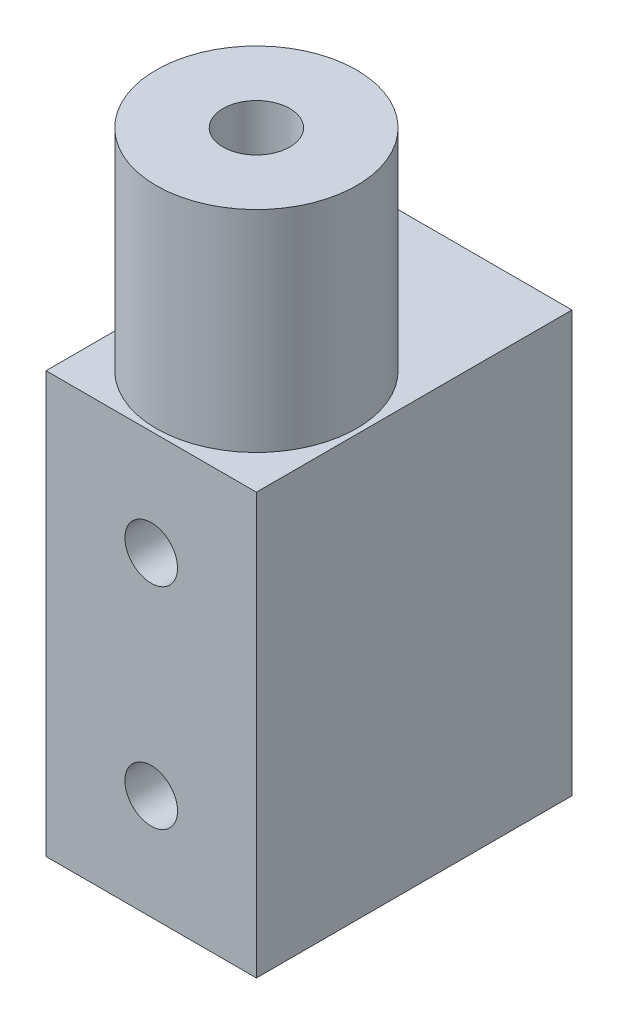
ISO-10303-21;
HEADER;
FILE_DESCRIPTION(('STEP AP214'),'2;1');
FILE_NAME('part.step','',(''),(''),'','','');
FILE_SCHEMA(('AUTOMOTIVE_DESIGN { 1 0 10303 214 1 1 1 1 }'));
ENDSEC;
DATA;
#1=APPLICATION_CONTEXT('core data for automotive mechanical design processes');
#2=APPLICATION_PROTOCOL_DEFINITION('international standard','automotive_design',2000,#1);
#3=PRODUCT_CONTEXT('',#1,'mechanical');
#4=PRODUCT('Part','Part','',(#3));
#5=PRODUCT_RELATED_PRODUCT_CATEGORY('part','',(#4));
#6=PRODUCT_DEFINITION_FORMATION('','',#4);
#7=PRODUCT_DEFINITION_CONTEXT('part definition',#1,'design');
#8=PRODUCT_DEFINITION('design','',#6,#7);
#9=PRODUCT_DEFINITION_SHAPE('','',#8);
#10=(LENGTH_UNIT() NAMED_UNIT(*) SI_UNIT(.MILLI.,.METRE.));
#11=(NAMED_UNIT(*) PLANE_ANGLE_UNIT() SI_UNIT($,.RADIAN.));
#12=(NAMED_UNIT(*) SI_UNIT($,.STERADIAN.) SOLID_ANGLE_UNIT());
#13=UNCERTAINTY_MEASURE_WITH_UNIT(LENGTH_MEASURE(1.E-05),#10,'distance_accuracy_value','');
#14=(GEOMETRIC_REPRESENTATION_CONTEXT(3) GLOBAL_UNCERTAINTY_ASSIGNED_CONTEXT((#13)) GLOBAL_UNIT_ASSIGNED_CONTEXT((#10,
#11,#12)) REPRESENTATION_CONTEXT('',''));
#15=CARTESIAN_POINT('',(0.,0.,0.));
#16=DIRECTION('',(0.,0.,1.));
#17=DIRECTION('',(1.,0.,0.));
#18=AXIS2_PLACEMENT_3D('',#15,#16,#17);
#19=CARTESIAN_POINT('',(0.,0.,-30.));
#20=DIRECTION('',(-1.,0.,0.));
#21=DIRECTION('',(0.,0.,1.));
#22=AXIS2_PLACEMENT_3D('',#19,#20,#21);
#23=PLANE('',#22);
#24=DIRECTION('',(0.,-1.,0.));
#25=VECTOR('',#24,1.);
#26=CARTESIAN_POINT('',(0.,0.,0.));
#27=LINE('',#26,#25);
#28=CARTESIAN_POINT('',(0.,40.,0.));
#29=VERTEX_POINT('',#28);
#30=CARTESIAN_POINT('',(0.,0.,0.));
#31=VERTEX_POINT('',#30);
#32=EDGE_CURVE('E99',#29,#31,#27,.T.);
#33=ORIENTED_EDGE('',*,*,#32,.F.);
#34=DIRECTION('',(0.,0.,1.));
#35=VECTOR('',#34,1.);
#36=CARTESIAN_POINT('',(0.,40.,-30.));
#37=LINE('',#36,#35);
#38=CARTESIAN_POINT('',(0.,40.,-30.));
#39=VERTEX_POINT('',#38);
#40=EDGE_CURVE('E41',#39,#29,#37,.T.);
#41=ORIENTED_EDGE('',*,*,#40,.F.);
#42=DIRECTION('',(0.,-1.,0.));
#43=VECTOR('',#42,1.);
#44=CARTESIAN_POINT('',(0.,0.,-30.));
#45=LINE('',#44,#43);
#46=CARTESIAN_POINT('',(0.,0.,-30.));
#47=VERTEX_POINT('',#46);
#48=EDGE_CURVE('E92',#39,#47,#45,.T.);
#49=ORIENTED_EDGE('',*,*,#48,.T.);
#50=DIRECTION('',(0.,0.,1.));
#51=VECTOR('',#50,1.);
#52=CARTESIAN_POINT('',(0.,0.,-30.));
#53=LINE('',#52,#51);
#54=EDGE_CURVE('E35',#47,#31,#53,.T.);
#55=ORIENTED_EDGE('',*,*,#54,.T.);
#56=EDGE_LOOP('',(#33,#41,#49,#55));
#57=FACE_BOUND('',#56,.T.);
#58=ADVANCED_FACE('F32',(#57),#23,.T.);
#59=CARTESIAN_POINT('',(0.,40.,-30.));
#60=DIRECTION('',(0.,1.,0.));
#61=DIRECTION('',(0.,0.,1.));
#62=AXIS2_PLACEMENT_3D('',#59,#60,#61);
#63=PLANE('',#62);
#64=CARTESIAN_POINT('',(10.,40.,-10.));
#65=DIRECTION('',(0.,1.,0.));
#66=DIRECTION('',(0.,0.,1.));
#67=AXIS2_PLACEMENT_3D('',#64,#65,#66);
#68=CIRCLE('',#67,9.52500000000001);
#69=CARTESIAN_POINT('',(10.,40.,-0.474999999999993));
#70=VERTEX_POINT('',#69);
#71=EDGE_CURVE('E11',#70,#70,#68,.T.);
#72=ORIENTED_EDGE('',*,*,#71,.F.);
#73=EDGE_LOOP('',(#72));
#74=FACE_BOUND('',#73,.T.);
#75=DIRECTION('',(-1.,0.,0.));
#76=VECTOR('',#75,1.);
#77=CARTESIAN_POINT('',(0.,40.,0.));
#78=LINE('',#77,#76);
#79=CARTESIAN_POINT('',(20.,40.,0.));
#80=VERTEX_POINT('',#79);
#81=EDGE_CURVE('E94',#80,#29,#78,.T.);
#82=ORIENTED_EDGE('',*,*,#81,.F.);
#83=DIRECTION('',(0.,0.,1.));
#84=VECTOR('',#83,1.);
#85=CARTESIAN_POINT('',(20.,40.,-30.));
#86=LINE('',#85,#84);
#87=CARTESIAN_POINT('',(20.,40.,-30.));
#88=VERTEX_POINT('',#87);
#89=EDGE_CURVE('E66',#88,#80,#86,.T.);
#90=ORIENTED_EDGE('',*,*,#89,.F.);
#91=DIRECTION('',(-1.,0.,0.));
#92=VECTOR('',#91,1.);
#93=CARTESIAN_POINT('',(0.,40.,-30.));
#94=LINE('',#93,#92);
#95=EDGE_CURVE('E89',#88,#39,#94,.T.);
#96=ORIENTED_EDGE('',*,*,#95,.T.);
#97=ORIENTED_EDGE('',*,*,#40,.T.);
#98=EDGE_LOOP('',(#82,#90,#96,#97));
#99=FACE_BOUND('',#98,.T.);
#100=ADVANCED_FACE('F111',(#74,#99),#63,.T.);
#101=CARTESIAN_POINT('',(20.,0.,-30.));
#102=DIRECTION('',(1.,0.,0.));
#103=DIRECTION('',(0.,1.,0.));
#104=AXIS2_PLACEMENT_3D('',#101,#102,#103);
#105=PLANE('',#104);
#106=DIRECTION('',(0.,1.,0.));
#107=VECTOR('',#106,1.);
#108=CARTESIAN_POINT('',(20.,0.,0.));
#109=LINE('',#108,#107);
#110=CARTESIAN_POINT('',(20.,0.,0.));
#111=VERTEX_POINT('',#110);
#112=EDGE_CURVE('E84',#111,#80,#109,.T.);
#113=ORIENTED_EDGE('',*,*,#112,.F.);
#114=DIRECTION('',(0.,0.,1.));
#115=VECTOR('',#114,1.);
#116=CARTESIAN_POINT('',(20.,0.,-30.));
#117=LINE('',#116,#115);
#118=CARTESIAN_POINT('',(20.,0.,-30.));
#119=VERTEX_POINT('',#118);
#120=EDGE_CURVE('E79',#119,#111,#117,.T.);
#121=ORIENTED_EDGE('',*,*,#120,.F.);
#122=DIRECTION('',(0.,1.,0.));
#123=VECTOR('',#122,1.);
#124=CARTESIAN_POINT('',(20.,0.,-30.));
#125=LINE('',#124,#123);
#126=EDGE_CURVE('E82',#119,#88,#125,.T.);
#127=ORIENTED_EDGE('',*,*,#126,.T.);
#128=ORIENTED_EDGE('',*,*,#89,.T.);
#129=EDGE_LOOP('',(#113,#121,#127,#128));
#130=FACE_BOUND('',#129,.T.);
#131=ADVANCED_FACE('F81',(#130),#105,.T.);
#132=CARTESIAN_POINT('',(0.,0.,-30.));
#133=DIRECTION('',(0.,-1.,0.));
#134=DIRECTION('',(1.,0.,0.));
#135=AXIS2_PLACEMENT_3D('',#132,#133,#134);
#136=PLANE('',#135);
#137=DIRECTION('',(1.,0.,0.));
#138=VECTOR('',#137,1.);
#139=CARTESIAN_POINT('',(0.,0.,0.));
#140=LINE('',#139,#138);
#141=EDGE_CURVE('E102',#31,#111,#140,.T.);
#142=ORIENTED_EDGE('',*,*,#141,.F.);
#143=ORIENTED_EDGE('',*,*,#54,.F.);
#144=DIRECTION('',(1.,0.,0.));
#145=VECTOR('',#144,1.);
#146=CARTESIAN_POINT('',(0.,0.,-30.));
#147=LINE('',#146,#145);
#148=EDGE_CURVE('E88',#47,#119,#147,.T.);
#149=ORIENTED_EDGE('',*,*,#148,.T.);
#150=ORIENTED_EDGE('',*,*,#120,.T.);
#151=EDGE_LOOP('',(#142,#143,#149,#150));
#152=FACE_BOUND('',#151,.T.);
#153=ADVANCED_FACE('F91',(#152),#136,.T.);
#154=CARTESIAN_POINT('',(0.,0.,-30.));
#155=DIRECTION('',(0.,0.,-1.));
#156=DIRECTION('',(-1.,0.,0.));
#157=AXIS2_PLACEMENT_3D('',#154,#155,#156);
#158=PLANE('',#157);
#159=CARTESIAN_POINT('',(10.,10.,-30.));
#160=DIRECTION('',(0.,0.,1.));
#161=DIRECTION('',(1.,0.,0.));
#162=AXIS2_PLACEMENT_3D('',#159,#160,#161);
#163=CIRCLE('',#162,2.5);
#164=CARTESIAN_POINT('',(12.5,10.,-30.));
#165=VERTEX_POINT('',#164);
#166=EDGE_CURVE('E172',#165,#165,#163,.T.);
#167=ORIENTED_EDGE('',*,*,#166,.T.);
#168=EDGE_LOOP('',(#167));
#169=FACE_BOUND('',#168,.T.);
#170=CARTESIAN_POINT('',(10.,30.,-30.));
#171=DIRECTION('',(0.,0.,1.));
#172=DIRECTION('',(1.,0.,0.));
#173=AXIS2_PLACEMENT_3D('',#170,#171,#172);
#174=CIRCLE('',#173,2.49999999999999);
#175=CARTESIAN_POINT('',(12.5,30.,-30.));
#176=VERTEX_POINT('',#175);
#177=EDGE_CURVE('E103',#176,#176,#174,.T.);
#178=ORIENTED_EDGE('',*,*,#177,.T.);
#179=EDGE_LOOP('',(#178));
#180=FACE_BOUND('',#179,.T.);
#181=ORIENTED_EDGE('',*,*,#48,.F.);
#182=ORIENTED_EDGE('',*,*,#95,.F.);
#183=ORIENTED_EDGE('',*,*,#126,.F.);
#184=ORIENTED_EDGE('',*,*,#148,.F.);
#185=EDGE_LOOP('',(#181,#182,#183,#184));
#186=FACE_BOUND('',#185,.T.);
#187=ADVANCED_FACE('F87',(#169,#180,#186),#158,.T.);
#188=CARTESIAN_POINT('',(0.,0.,0.));
#189=DIRECTION('',(0.,0.,-1.));
#190=DIRECTION('',(-1.,0.,0.));
#191=AXIS2_PLACEMENT_3D('',#188,#189,#190);
#192=PLANE('',#191);
#193=CARTESIAN_POINT('',(10.,10.,0.));
#194=DIRECTION('',(0.,0.,1.));
#195=DIRECTION('',(1.,0.,0.));
#196=AXIS2_PLACEMENT_3D('',#193,#194,#195);
#197=CIRCLE('',#196,2.5);
#198=CARTESIAN_POINT('',(12.5,10.,0.));
#199=VERTEX_POINT('',#198);
#200=EDGE_CURVE('E167',#199,#199,#197,.T.);
#201=ORIENTED_EDGE('',*,*,#200,.F.);
#202=EDGE_LOOP('',(#201));
#203=FACE_BOUND('',#202,.T.);
#204=CARTESIAN_POINT('',(10.,30.,0.));
#205=DIRECTION('',(0.,0.,1.));
#206=DIRECTION('',(1.,0.,0.));
#207=AXIS2_PLACEMENT_3D('',#204,#205,#206);
#208=CIRCLE('',#207,2.49999999999999);
#209=CARTESIAN_POINT('',(12.5,30.,0.));
#210=VERTEX_POINT('',#209);
#211=EDGE_CURVE('E174',#210,#210,#208,.T.);
#212=ORIENTED_EDGE('',*,*,#211,.F.);
#213=EDGE_LOOP('',(#212));
#214=FACE_BOUND('',#213,.T.);
#215=ORIENTED_EDGE('',*,*,#32,.T.);
#216=ORIENTED_EDGE('',*,*,#141,.T.);
#217=ORIENTED_EDGE('',*,*,#112,.T.);
#218=ORIENTED_EDGE('',*,*,#81,.T.);
#219=EDGE_LOOP('',(#215,#216,#217,#218));
#220=FACE_BOUND('',#219,.T.);
#221=ADVANCED_FACE('F110',(#203,#214,#220),#192,.F.);
#222=CARTESIAN_POINT('',(10.,30.,-30.));
#223=DIRECTION('',(0.,0.,1.));
#224=DIRECTION('',(1.,0.,0.));
#225=AXIS2_PLACEMENT_3D('',#222,#223,#224);
#226=CYLINDRICAL_SURFACE('',#225,2.49999999999999);
#227=ORIENTED_EDGE('',*,*,#177,.F.);
#228=EDGE_LOOP('',(#227));
#229=FACE_BOUND('',#228,.T.);
#230=ORIENTED_EDGE('',*,*,#211,.T.);
#231=EDGE_LOOP('',(#230));
#232=FACE_BOUND('',#231,.T.);
#233=ADVANCED_FACE('F131',(#229,#232),#226,.F.);
#234=CARTESIAN_POINT('',(10.,10.,-30.));
#235=DIRECTION('',(0.,0.,1.));
#236=DIRECTION('',(1.,0.,0.));
#237=AXIS2_PLACEMENT_3D('',#234,#235,#236);
#238=CYLINDRICAL_SURFACE('',#237,2.5);
#239=ORIENTED_EDGE('',*,*,#166,.F.);
#240=EDGE_LOOP('',(#239));
#241=FACE_BOUND('',#240,.T.);
#242=ORIENTED_EDGE('',*,*,#200,.T.);
#243=EDGE_LOOP('',(#242));
#244=FACE_BOUND('',#243,.T.);
#245=ADVANCED_FACE('F138',(#241,#244),#238,.F.);
#246=CARTESIAN_POINT('',(10.,60.,-10.));
#247=DIRECTION('',(0.,-1.,0.));
#248=DIRECTION('',(0.,0.,-1.));
#249=AXIS2_PLACEMENT_3D('',#246,#247,#248);
#250=CYLINDRICAL_SURFACE('',#249,9.52500000000001);
#251=CARTESIAN_POINT('',(10.,60.,-10.));
#252=DIRECTION('',(0.,1.,0.));
#253=DIRECTION('',(0.,0.,1.));
#254=AXIS2_PLACEMENT_3D('',#251,#252,#253);
#255=CIRCLE('',#254,9.52500000000001);
#256=CARTESIAN_POINT('',(10.,60.,-0.474999999999993));
#257=VERTEX_POINT('',#256);
#258=EDGE_CURVE('E163',#257,#257,#255,.T.);
#259=ORIENTED_EDGE('',*,*,#258,.F.);
#260=EDGE_LOOP('',(#259));
#261=FACE_BOUND('',#260,.T.);
#262=ORIENTED_EDGE('',*,*,#71,.T.);
#263=EDGE_LOOP('',(#262));
#264=FACE_BOUND('',#263,.T.);
#265=ADVANCED_FACE('F142',(#261,#264),#250,.T.);
#266=CARTESIAN_POINT('',(10.,60.,-10.));
#267=DIRECTION('',(0.,1.,0.));
#268=DIRECTION('',(0.,0.,1.));
#269=AXIS2_PLACEMENT_3D('',#266,#267,#268);
#270=PLANE('',#269);
#271=CARTESIAN_POINT('',(10.,60.,-10.));
#272=DIRECTION('',(0.,1.,0.));
#273=DIRECTION('',(0.,0.,1.));
#274=AXIS2_PLACEMENT_3D('',#271,#272,#273);
#275=CIRCLE('',#274,3.175);
#276=CARTESIAN_POINT('',(10.,60.,-6.825));
#277=VERTEX_POINT('',#276);
#278=EDGE_CURVE('E164',#277,#277,#275,.T.);
#279=ORIENTED_EDGE('',*,*,#278,.F.);
#280=EDGE_LOOP('',(#279));
#281=FACE_BOUND('',#280,.T.);
#282=ORIENTED_EDGE('',*,*,#258,.T.);
#283=EDGE_LOOP('',(#282));
#284=FACE_BOUND('',#283,.T.);
#285=ADVANCED_FACE('F146',(#281,#284),#270,.T.);
#286=CARTESIAN_POINT('',(10.,31.0197438789308,-10.));
#287=DIRECTION('',(0.,1.,0.));
#288=DIRECTION('',(0.,0.,1.));
#289=AXIS2_PLACEMENT_3D('',#286,#287,#288);
#290=CYLINDRICAL_SURFACE('',#289,3.175);
#291=CARTESIAN_POINT('',(10.,40.,-10.));
#292=DIRECTION('',(0.,1.,0.));
#293=DIRECTION('',(0.,0.,1.));
#294=AXIS2_PLACEMENT_3D('',#291,#292,#293);
#295=CIRCLE('',#294,3.175);
#296=CARTESIAN_POINT('',(10.,40.,-6.825));
#297=VERTEX_POINT('',#296);
#298=EDGE_CURVE('E162',#297,#297,#295,.F.);
#299=CARTESIAN_POINT('',(10.,40.,-6.825));
#300=CARTESIAN_POINT('',(10.,40.2083333333333,-6.825));
#301=CARTESIAN_POINT('',(10.,40.4166666666667,-6.825));
#302=CARTESIAN_POINT('',(10.,40.8333333333333,-6.825));
#303=CARTESIAN_POINT('',(10.,41.0416666666667,-6.825));
#304=CARTESIAN_POINT('',(10.,41.4583333333333,-6.825));
#305=CARTESIAN_POINT('',(10.,41.6666666666667,-6.825));
#306=CARTESIAN_POINT('',(10.,42.0833333333333,-6.825));
#307=CARTESIAN_POINT('',(10.,42.2916666666667,-6.825));
#308=CARTESIAN_POINT('',(10.,42.7083333333333,-6.825));
#309=CARTESIAN_POINT('',(10.,42.9166666666667,-6.825));
#310=CARTESIAN_POINT('',(10.,43.3333333333333,-6.825));
#311=CARTESIAN_POINT('',(10.,43.5416666666667,-6.825));
#312=CARTESIAN_POINT('',(10.,43.9583333333333,-6.825));
#313=CARTESIAN_POINT('',(10.,44.1666666666667,-6.825));
#314=CARTESIAN_POINT('',(10.,44.5833333333333,-6.825));
#315=CARTESIAN_POINT('',(10.,44.7916666666667,-6.825));
#316=CARTESIAN_POINT('',(10.,45.2083333333333,-6.825));
#317=CARTESIAN_POINT('',(10.,45.4166666666667,-6.825));
#318=CARTESIAN_POINT('',(10.,45.8333333333333,-6.825));
#319=CARTESIAN_POINT('',(10.,46.0416666666667,-6.825));
#320=CARTESIAN_POINT('',(10.,46.4583333333333,-6.825));
#321=CARTESIAN_POINT('',(10.,46.6666666666667,-6.825));
#322=CARTESIAN_POINT('',(10.,47.0833333333333,-6.825));
#323=CARTESIAN_POINT('',(10.,47.2916666666667,-6.825));
#324=CARTESIAN_POINT('',(10.,47.7083333333333,-6.825));
#325=CARTESIAN_POINT('',(10.,47.9166666666667,-6.825));
#326=CARTESIAN_POINT('',(10.,48.3333333333333,-6.825));
#327=CARTESIAN_POINT('',(10.,48.5416666666667,-6.825));
#328=CARTESIAN_POINT('',(10.,48.9583333333333,-6.825));
#329=CARTESIAN_POINT('',(10.,49.1666666666667,-6.825));
#330=CARTESIAN_POINT('',(10.,49.5833333333333,-6.825));
#331=CARTESIAN_POINT('',(10.,49.7916666666667,-6.825));
#332=CARTESIAN_POINT('',(10.,50.2083333333333,-6.825));
#333=CARTESIAN_POINT('',(10.,50.4166666666667,-6.825));
#334=CARTESIAN_POINT('',(10.,50.8333333333333,-6.825));
#335=CARTESIAN_POINT('',(10.,51.0416666666667,-6.825));
#336=CARTESIAN_POINT('',(10.,51.4583333333333,-6.825));
#337=CARTESIAN_POINT('',(10.,51.6666666666667,-6.825));
#338=CARTESIAN_POINT('',(10.,52.0833333333333,-6.825));
#339=CARTESIAN_POINT('',(10.,52.2916666666667,-6.825));
#340=CARTESIAN_POINT('',(10.,52.7083333333333,-6.825));
#341=CARTESIAN_POINT('',(10.,52.9166666666667,-6.825));
#342=CARTESIAN_POINT('',(10.,53.3333333333333,-6.825));
#343=CARTESIAN_POINT('',(10.,53.5416666666667,-6.825));
#344=CARTESIAN_POINT('',(10.,53.9583333333333,-6.825));
#345=CARTESIAN_POINT('',(10.,54.1666666666667,-6.825));
#346=CARTESIAN_POINT('',(10.,54.5833333333333,-6.825));
#347=CARTESIAN_POINT('',(10.,54.7916666666667,-6.825));
#348=CARTESIAN_POINT('',(10.,55.2083333333333,-6.825));
#349=CARTESIAN_POINT('',(10.,55.4166666666667,-6.825));
#350=CARTESIAN_POINT('',(10.,55.8333333333333,-6.825));
#351=CARTESIAN_POINT('',(10.,56.0416666666667,-6.825));
#352=CARTESIAN_POINT('',(10.,56.4583333333333,-6.825));
#353=CARTESIAN_POINT('',(10.,56.6666666666667,-6.825));
#354=CARTESIAN_POINT('',(10.,57.0833333333333,-6.825));
#355=CARTESIAN_POINT('',(10.,57.2916666666667,-6.825));
#356=CARTESIAN_POINT('',(10.,57.7083333333333,-6.825));
#357=CARTESIAN_POINT('',(10.,57.9166666666667,-6.825));
#358=CARTESIAN_POINT('',(10.,58.3333333333333,-6.825));
#359=CARTESIAN_POINT('',(10.,58.5416666666667,-6.825));
#360=CARTESIAN_POINT('',(10.,58.9583333333333,-6.825));
#361=CARTESIAN_POINT('',(10.,59.1666666666667,-6.825));
#362=CARTESIAN_POINT('',(10.,59.5833333333333,-6.825));
#363=CARTESIAN_POINT('',(10.,59.7916666666667,-6.825));
#364=CARTESIAN_POINT('',(10.,60.,-6.825));
#365=B_SPLINE_CURVE_WITH_KNOTS('',3,(#299,#300,#301,#302,#303,#304,#305,#306,#307,#308,#309,
#310,#311,#312,#313,#314,#315,#316,#317,#318,#319,#320,#321,#322,#323,#324,#325,#326,#327,#328,
#329,#330,#331,#332,#333,#334,#335,#336,#337,#338,#339,#340,#341,#342,#343,#344,#345,#346,#347,
#348,#349,#350,#351,#352,#353,#354,#355,#356,#357,#358,#359,#360,#361,#362,#363,#364),
.UNSPECIFIED.,.F.,.F.,(4,2,2,2,2,2,2,2,2,2,2,2,2,2,2,2,2,2,2,2,2,2,2,2,2,2,2,2,2,2,2,2,4),(0.,
0.625000000000001,1.24999999999999,1.87499999999999,2.5,3.125,3.75,4.375,5.,5.625,6.25,6.875,
7.5,8.125,8.75,9.37499999999999,9.99999999999999,10.625,11.25,11.875,12.5,13.125,13.75,14.375,
15.,15.625,16.25,16.875,17.5,18.125,18.75,19.375,20.),.UNSPECIFIED.);
#366=EDGE_CURVE('BSEAM150',#297,#277,#365,.T.);
#367=ORIENTED_EDGE('',*,*,#298,.T.);
#368=ORIENTED_EDGE('',*,*,#278,.T.);
#369=ORIENTED_EDGE('',*,*,#366,.T.);
#370=ORIENTED_EDGE('',*,*,#366,.F.);
#371=EDGE_LOOP('',(#367,#369,#368,#370));
#372=FACE_BOUND('',#371,.T.);
#373=ADVANCED_FACE('F150',(#372),#290,.F.);
#374=CARTESIAN_POINT('',(0.,40.,-30.));
#375=DIRECTION('',(0.,1.,0.));
#376=DIRECTION('',(0.,0.,1.));
#377=AXIS2_PLACEMENT_3D('',#374,#375,#376);
#378=PLANE('',#377);
#379=ORIENTED_EDGE('',*,*,#298,.F.);
#380=EDGE_LOOP('',(#379));
#381=FACE_BOUND('',#380,.T.);
#382=ADVANCED_FACE('F154',(#381),#378,.T.);
#383=CLOSED_SHELL('',(#58,#100,#131,#153,#187,#221,#233,#245,#265,#285,#373,#382));
#384=MANIFOLD_SOLID_BREP('B2',#383);
#385=ADVANCED_BREP_SHAPE_REPRESENTATION('',(#18,#384),#14);
#386=SHAPE_DEFINITION_REPRESENTATION(#9,#385);
ENDSEC;
END-ISO-10303-21;
